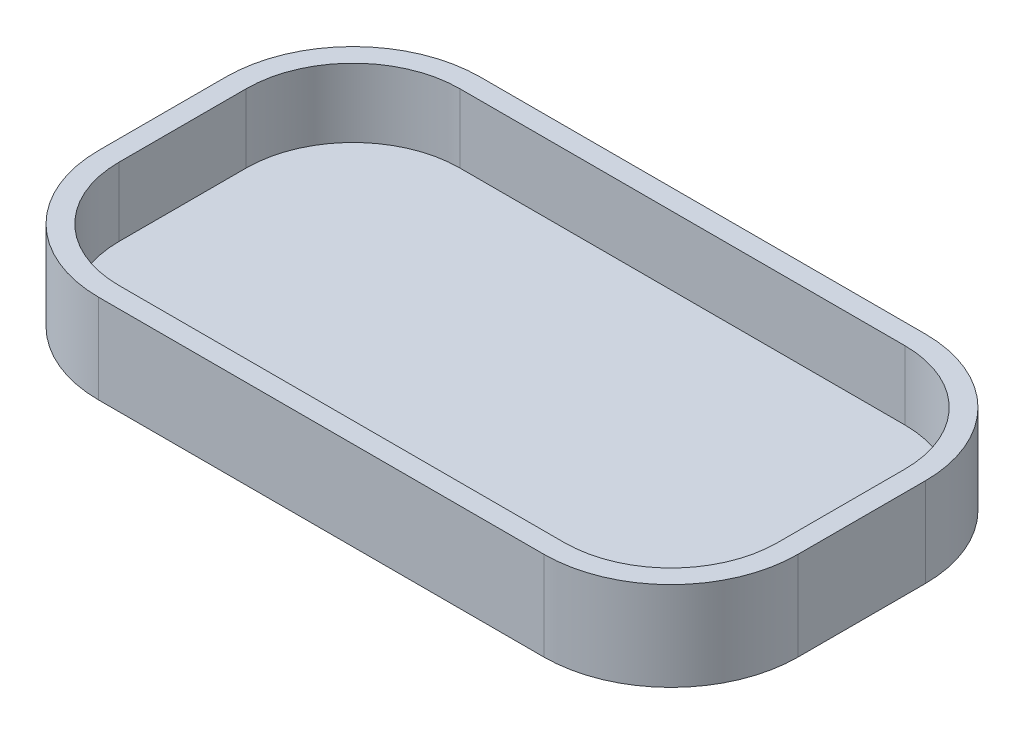
ISO-10303-21;
HEADER;
FILE_DESCRIPTION(('STEP AP214'),'2;1');
FILE_NAME('part.step','',(''),(''),'','','');
FILE_SCHEMA(('AUTOMOTIVE_DESIGN { 1 0 10303 214 1 1 1 1 }'));
ENDSEC;
DATA;
#1=APPLICATION_CONTEXT('core data for automotive mechanical design processes');
#2=APPLICATION_PROTOCOL_DEFINITION('international standard','automotive_design',2000,#1);
#3=PRODUCT_CONTEXT('',#1,'mechanical');
#4=PRODUCT('Part','Part','',(#3));
#5=PRODUCT_RELATED_PRODUCT_CATEGORY('part','',(#4));
#6=PRODUCT_DEFINITION_FORMATION('','',#4);
#7=PRODUCT_DEFINITION_CONTEXT('part definition',#1,'design');
#8=PRODUCT_DEFINITION('design','',#6,#7);
#9=PRODUCT_DEFINITION_SHAPE('','',#8);
#10=(LENGTH_UNIT() NAMED_UNIT(*) SI_UNIT(.MILLI.,.METRE.));
#11=(NAMED_UNIT(*) PLANE_ANGLE_UNIT() SI_UNIT($,.RADIAN.));
#12=(NAMED_UNIT(*) SI_UNIT($,.STERADIAN.) SOLID_ANGLE_UNIT());
#13=UNCERTAINTY_MEASURE_WITH_UNIT(LENGTH_MEASURE(1.E-05),#10,'distance_accuracy_value','');
#14=(GEOMETRIC_REPRESENTATION_CONTEXT(3) GLOBAL_UNCERTAINTY_ASSIGNED_CONTEXT((#13)) GLOBAL_UNIT_ASSIGNED_CONTEXT((#10,
#11,#12)) REPRESENTATION_CONTEXT('',''));
#15=CARTESIAN_POINT('',(0.,0.,0.));
#16=DIRECTION('',(0.,0.,1.));
#17=DIRECTION('',(1.,0.,0.));
#18=AXIS2_PLACEMENT_3D('',#15,#16,#17);
#19=CARTESIAN_POINT('',(0.,7.,0.));
#20=DIRECTION('',(-1.,0.,0.));
#21=DIRECTION('',(0.,0.,1.));
#22=AXIS2_PLACEMENT_3D('',#19,#20,#21);
#23=PLANE('',#22);
#24=DIRECTION('',(0.,0.,-1.));
#25=VECTOR('',#24,1.);
#26=CARTESIAN_POINT('',(0.,0.,0.));
#27=LINE('',#26,#25);
#28=CARTESIAN_POINT('',(0.,0.,-10.));
#29=VERTEX_POINT('',#28);
#30=CARTESIAN_POINT('',(0.,0.,-20.));
#31=VERTEX_POINT('',#30);
#32=EDGE_CURVE('E235',#29,#31,#27,.T.);
#33=ORIENTED_EDGE('',*,*,#32,.T.);
#34=DIRECTION('',(0.,-1.,0.));
#35=VECTOR('',#34,1.);
#36=CARTESIAN_POINT('',(0.,7.,-20.));
#37=LINE('',#36,#35);
#38=CARTESIAN_POINT('',(0.,7.,-20.));
#39=VERTEX_POINT('',#38);
#40=EDGE_CURVE('E312',#31,#39,#37,.F.);
#41=ORIENTED_EDGE('',*,*,#40,.T.);
#42=DIRECTION('',(0.,0.,-1.));
#43=VECTOR('',#42,1.);
#44=CARTESIAN_POINT('',(0.,7.,0.));
#45=LINE('',#44,#43);
#46=CARTESIAN_POINT('',(0.,7.,-10.));
#47=VERTEX_POINT('',#46);
#48=EDGE_CURVE('E263',#47,#39,#45,.T.);
#49=ORIENTED_EDGE('',*,*,#48,.F.);
#50=DIRECTION('',(0.,-1.,0.));
#51=VECTOR('',#50,1.);
#52=CARTESIAN_POINT('',(0.,7.,-10.));
#53=LINE('',#52,#51);
#54=EDGE_CURVE('E313',#47,#29,#53,.T.);
#55=ORIENTED_EDGE('',*,*,#54,.T.);
#56=EDGE_LOOP('',(#33,#41,#49,#55));
#57=FACE_BOUND('',#56,.T.);
#58=ADVANCED_FACE('F51',(#57),#23,.F.);
#59=CARTESIAN_POINT('',(0.,7.,-30.));
#60=DIRECTION('',(0.,0.,1.));
#61=DIRECTION('',(1.,0.,0.));
#62=AXIS2_PLACEMENT_3D('',#59,#60,#61);
#63=PLANE('',#62);
#64=DIRECTION('',(-1.,0.,0.));
#65=VECTOR('',#64,1.);
#66=CARTESIAN_POINT('',(0.,7.,-30.));
#67=LINE('',#66,#65);
#68=CARTESIAN_POINT('',(-10.,7.,-30.));
#69=VERTEX_POINT('',#68);
#70=CARTESIAN_POINT('',(-45.,7.,-30.));
#71=VERTEX_POINT('',#70);
#72=EDGE_CURVE('E270',#69,#71,#67,.T.);
#73=ORIENTED_EDGE('',*,*,#72,.F.);
#74=DIRECTION('',(0.,-1.,0.));
#75=VECTOR('',#74,1.);
#76=CARTESIAN_POINT('',(-10.,7.,-30.));
#77=LINE('',#76,#75);
#78=CARTESIAN_POINT('',(-10.,0.,-30.));
#79=VERTEX_POINT('',#78);
#80=EDGE_CURVE('E293',#69,#79,#77,.T.);
#81=ORIENTED_EDGE('',*,*,#80,.T.);
#82=DIRECTION('',(-1.,0.,0.));
#83=VECTOR('',#82,1.);
#84=CARTESIAN_POINT('',(0.,0.,-30.));
#85=LINE('',#84,#83);
#86=CARTESIAN_POINT('',(-45.,0.,-30.));
#87=VERTEX_POINT('',#86);
#88=EDGE_CURVE('E285',#79,#87,#85,.T.);
#89=ORIENTED_EDGE('',*,*,#88,.T.);
#90=DIRECTION('',(0.,-1.,0.));
#91=VECTOR('',#90,1.);
#92=CARTESIAN_POINT('',(-45.,7.,-30.));
#93=LINE('',#92,#91);
#94=EDGE_CURVE('E276',#87,#71,#93,.F.);
#95=ORIENTED_EDGE('',*,*,#94,.T.);
#96=EDGE_LOOP('',(#73,#81,#89,#95));
#97=FACE_BOUND('',#96,.T.);
#98=ADVANCED_FACE('F370',(#97),#63,.F.);
#99=CARTESIAN_POINT('',(-55.,7.,0.));
#100=DIRECTION('',(1.,0.,0.));
#101=DIRECTION('',(0.,0.,-1.));
#102=AXIS2_PLACEMENT_3D('',#99,#100,#101);
#103=PLANE('',#102);
#104=DIRECTION('',(0.,0.,1.));
#105=VECTOR('',#104,1.);
#106=CARTESIAN_POINT('',(-55.,7.,0.));
#107=LINE('',#106,#105);
#108=CARTESIAN_POINT('',(-55.,7.,-20.));
#109=VERTEX_POINT('',#108);
#110=CARTESIAN_POINT('',(-55.,7.,-10.));
#111=VERTEX_POINT('',#110);
#112=EDGE_CURVE('E275',#109,#111,#107,.T.);
#113=ORIENTED_EDGE('',*,*,#112,.F.);
#114=DIRECTION('',(0.,-1.,0.));
#115=VECTOR('',#114,1.);
#116=CARTESIAN_POINT('',(-55.,7.,-20.));
#117=LINE('',#116,#115);
#118=CARTESIAN_POINT('',(-55.,0.,-20.));
#119=VERTEX_POINT('',#118);
#120=EDGE_CURVE('E11',#109,#119,#117,.T.);
#121=ORIENTED_EDGE('',*,*,#120,.T.);
#122=DIRECTION('',(0.,0.,1.));
#123=VECTOR('',#122,1.);
#124=CARTESIAN_POINT('',(-55.,0.,0.));
#125=LINE('',#124,#123);
#126=CARTESIAN_POINT('',(-55.,0.,-10.));
#127=VERTEX_POINT('',#126);
#128=EDGE_CURVE('E290',#119,#127,#125,.T.);
#129=ORIENTED_EDGE('',*,*,#128,.T.);
#130=DIRECTION('',(0.,-1.,0.));
#131=VECTOR('',#130,1.);
#132=CARTESIAN_POINT('',(-55.,7.,-10.));
#133=LINE('',#132,#131);
#134=EDGE_CURVE('E58',#127,#111,#133,.F.);
#135=ORIENTED_EDGE('',*,*,#134,.T.);
#136=EDGE_LOOP('',(#113,#121,#129,#135));
#137=FACE_BOUND('',#136,.T.);
#138=ADVANCED_FACE('F338',(#137),#103,.F.);
#139=CARTESIAN_POINT('',(0.,7.,0.));
#140=DIRECTION('',(0.,0.,-1.));
#141=DIRECTION('',(-1.,0.,0.));
#142=AXIS2_PLACEMENT_3D('',#139,#140,#141);
#143=PLANE('',#142);
#144=DIRECTION('',(1.,0.,0.));
#145=VECTOR('',#144,1.);
#146=CARTESIAN_POINT('',(0.,0.,0.));
#147=LINE('',#146,#145);
#148=CARTESIAN_POINT('',(-45.,0.,0.));
#149=VERTEX_POINT('',#148);
#150=CARTESIAN_POINT('',(-10.,0.,0.));
#151=VERTEX_POINT('',#150);
#152=EDGE_CURVE('E268',#149,#151,#147,.T.);
#153=ORIENTED_EDGE('',*,*,#152,.T.);
#154=DIRECTION('',(0.,-1.,0.));
#155=VECTOR('',#154,1.);
#156=CARTESIAN_POINT('',(-10.,7.,0.));
#157=LINE('',#156,#155);
#158=CARTESIAN_POINT('',(-10.,7.,0.));
#159=VERTEX_POINT('',#158);
#160=EDGE_CURVE('E73',#151,#159,#157,.F.);
#161=ORIENTED_EDGE('',*,*,#160,.T.);
#162=DIRECTION('',(1.,0.,0.));
#163=VECTOR('',#162,1.);
#164=CARTESIAN_POINT('',(0.,7.,0.));
#165=LINE('',#164,#163);
#166=CARTESIAN_POINT('',(-45.,7.,0.));
#167=VERTEX_POINT('',#166);
#168=EDGE_CURVE('E277',#167,#159,#165,.T.);
#169=ORIENTED_EDGE('',*,*,#168,.F.);
#170=DIRECTION('',(0.,-1.,0.));
#171=VECTOR('',#170,1.);
#172=CARTESIAN_POINT('',(-45.,7.,0.));
#173=LINE('',#172,#171);
#174=EDGE_CURVE('E329',#167,#149,#173,.T.);
#175=ORIENTED_EDGE('',*,*,#174,.T.);
#176=EDGE_LOOP('',(#153,#161,#169,#175));
#177=FACE_BOUND('',#176,.T.);
#178=ADVANCED_FACE('F349',(#177),#143,.F.);
#179=CARTESIAN_POINT('',(0.,7.,0.));
#180=DIRECTION('',(0.,1.,0.));
#181=DIRECTION('',(0.,0.,1.));
#182=AXIS2_PLACEMENT_3D('',#179,#180,#181);
#183=PLANE('',#182);
#184=DIRECTION('',(0.,0.,-1.));
#185=VECTOR('',#184,1.);
#186=CARTESIAN_POINT('',(-1.6,7.,0.));
#187=LINE('',#186,#185);
#188=CARTESIAN_POINT('',(-1.6,7.,-10.));
#189=VERTEX_POINT('',#188);
#190=CARTESIAN_POINT('',(-1.6,7.,-20.));
#191=VERTEX_POINT('',#190);
#192=EDGE_CURVE('E191',#189,#191,#187,.T.);
#193=ORIENTED_EDGE('',*,*,#192,.F.);
#194=CARTESIAN_POINT('',(-10.,7.,-10.));
#195=DIRECTION('',(0.,1.,0.));
#196=DIRECTION('',(0.,0.,1.));
#197=AXIS2_PLACEMENT_3D('',#194,#195,#196);
#198=CIRCLE('',#197,8.4);
#199=CARTESIAN_POINT('',(-10.,7.,-1.6));
#200=VERTEX_POINT('',#199);
#201=EDGE_CURVE('E249',#200,#189,#198,.T.);
#202=ORIENTED_EDGE('',*,*,#201,.F.);
#203=DIRECTION('',(1.,0.,0.));
#204=VECTOR('',#203,1.);
#205=CARTESIAN_POINT('',(0.,7.,-1.6));
#206=LINE('',#205,#204);
#207=CARTESIAN_POINT('',(-45.,7.,-1.6));
#208=VERTEX_POINT('',#207);
#209=EDGE_CURVE('E70',#208,#200,#206,.T.);
#210=ORIENTED_EDGE('',*,*,#209,.F.);
#211=CARTESIAN_POINT('',(-45.,7.,-10.));
#212=DIRECTION('',(0.,1.,0.));
#213=DIRECTION('',(0.,0.,1.));
#214=AXIS2_PLACEMENT_3D('',#211,#212,#213);
#215=CIRCLE('',#214,8.4);
#216=CARTESIAN_POINT('',(-53.4,7.,-10.));
#217=VERTEX_POINT('',#216);
#218=EDGE_CURVE('E196',#217,#208,#215,.T.);
#219=ORIENTED_EDGE('',*,*,#218,.F.);
#220=DIRECTION('',(0.,0.,1.));
#221=VECTOR('',#220,1.);
#222=CARTESIAN_POINT('',(-53.4,7.,0.));
#223=LINE('',#222,#221);
#224=CARTESIAN_POINT('',(-53.4,7.,-20.));
#225=VERTEX_POINT('',#224);
#226=EDGE_CURVE('E251',#225,#217,#223,.T.);
#227=ORIENTED_EDGE('',*,*,#226,.F.);
#228=CARTESIAN_POINT('',(-45.,7.,-20.));
#229=DIRECTION('',(0.,1.,0.));
#230=DIRECTION('',(0.,0.,1.));
#231=AXIS2_PLACEMENT_3D('',#228,#229,#230);
#232=CIRCLE('',#231,8.4);
#233=CARTESIAN_POINT('',(-45.,7.,-28.4));
#234=VERTEX_POINT('',#233);
#235=EDGE_CURVE('E205',#234,#225,#232,.T.);
#236=ORIENTED_EDGE('',*,*,#235,.F.);
#237=DIRECTION('',(-1.,0.,0.));
#238=VECTOR('',#237,1.);
#239=CARTESIAN_POINT('',(0.,7.,-28.4));
#240=LINE('',#239,#238);
#241=CARTESIAN_POINT('',(-10.,7.,-28.4));
#242=VERTEX_POINT('',#241);
#243=EDGE_CURVE('E247',#242,#234,#240,.T.);
#244=ORIENTED_EDGE('',*,*,#243,.F.);
#245=CARTESIAN_POINT('',(-10.,7.,-20.));
#246=DIRECTION('',(0.,1.,0.));
#247=DIRECTION('',(0.,0.,1.));
#248=AXIS2_PLACEMENT_3D('',#245,#246,#247);
#249=CIRCLE('',#248,8.4);
#250=EDGE_CURVE('E244',#191,#242,#249,.T.);
#251=ORIENTED_EDGE('',*,*,#250,.F.);
#252=EDGE_LOOP('',(#193,#202,#210,#219,#227,#236,#244,#251));
#253=FACE_BOUND('',#252,.T.);
#254=ORIENTED_EDGE('',*,*,#48,.T.);
#255=CARTESIAN_POINT('',(-10.,7.,-20.));
#256=DIRECTION('',(0.,1.,0.));
#257=DIRECTION('',(0.,0.,1.));
#258=AXIS2_PLACEMENT_3D('',#255,#256,#257);
#259=CIRCLE('',#258,10.);
#260=EDGE_CURVE('E330',#39,#69,#259,.T.);
#261=ORIENTED_EDGE('',*,*,#260,.T.);
#262=ORIENTED_EDGE('',*,*,#72,.T.);
#263=CARTESIAN_POINT('',(-45.,7.,-20.));
#264=DIRECTION('',(0.,1.,0.));
#265=DIRECTION('',(0.,0.,1.));
#266=AXIS2_PLACEMENT_3D('',#263,#264,#265);
#267=CIRCLE('',#266,10.);
#268=EDGE_CURVE('E321',#71,#109,#267,.T.);
#269=ORIENTED_EDGE('',*,*,#268,.T.);
#270=ORIENTED_EDGE('',*,*,#112,.T.);
#271=CARTESIAN_POINT('',(-45.,7.,-10.));
#272=DIRECTION('',(0.,1.,0.));
#273=DIRECTION('',(0.,0.,1.));
#274=AXIS2_PLACEMENT_3D('',#271,#272,#273);
#275=CIRCLE('',#274,10.);
#276=EDGE_CURVE('E318',#111,#167,#275,.T.);
#277=ORIENTED_EDGE('',*,*,#276,.T.);
#278=ORIENTED_EDGE('',*,*,#168,.T.);
#279=CARTESIAN_POINT('',(-10.,7.,-10.));
#280=DIRECTION('',(0.,1.,0.));
#281=DIRECTION('',(0.,0.,1.));
#282=AXIS2_PLACEMENT_3D('',#279,#280,#281);
#283=CIRCLE('',#282,10.);
#284=EDGE_CURVE('E322',#159,#47,#283,.T.);
#285=ORIENTED_EDGE('',*,*,#284,.T.);
#286=EDGE_LOOP('',(#254,#261,#262,#269,#270,#277,#278,#285));
#287=FACE_BOUND('',#286,.T.);
#288=ADVANCED_FACE('F341',(#253,#287),#183,.T.);
#289=CARTESIAN_POINT('',(0.,0.,0.));
#290=DIRECTION('',(0.,1.,0.));
#291=DIRECTION('',(0.,0.,1.));
#292=AXIS2_PLACEMENT_3D('',#289,#290,#291);
#293=PLANE('',#292);
#294=ORIENTED_EDGE('',*,*,#88,.F.);
#295=CARTESIAN_POINT('',(-10.,0.,-20.));
#296=DIRECTION('',(0.,1.,0.));
#297=DIRECTION('',(0.,0.,1.));
#298=AXIS2_PLACEMENT_3D('',#295,#296,#297);
#299=CIRCLE('',#298,10.);
#300=EDGE_CURVE('E306',#79,#31,#299,.F.);
#301=ORIENTED_EDGE('',*,*,#300,.T.);
#302=ORIENTED_EDGE('',*,*,#32,.F.);
#303=CARTESIAN_POINT('',(-10.,0.,-10.));
#304=DIRECTION('',(0.,1.,0.));
#305=DIRECTION('',(0.,0.,1.));
#306=AXIS2_PLACEMENT_3D('',#303,#304,#305);
#307=CIRCLE('',#306,10.);
#308=EDGE_CURVE('E301',#29,#151,#307,.F.);
#309=ORIENTED_EDGE('',*,*,#308,.T.);
#310=ORIENTED_EDGE('',*,*,#152,.F.);
#311=CARTESIAN_POINT('',(-45.,0.,-10.));
#312=DIRECTION('',(0.,1.,0.));
#313=DIRECTION('',(0.,0.,1.));
#314=AXIS2_PLACEMENT_3D('',#311,#312,#313);
#315=CIRCLE('',#314,10.);
#316=EDGE_CURVE('E298',#149,#127,#315,.F.);
#317=ORIENTED_EDGE('',*,*,#316,.T.);
#318=ORIENTED_EDGE('',*,*,#128,.F.);
#319=CARTESIAN_POINT('',(-45.,0.,-20.));
#320=DIRECTION('',(0.,1.,0.));
#321=DIRECTION('',(0.,0.,1.));
#322=AXIS2_PLACEMENT_3D('',#319,#320,#321);
#323=CIRCLE('',#322,10.);
#324=EDGE_CURVE('E305',#119,#87,#323,.F.);
#325=ORIENTED_EDGE('',*,*,#324,.T.);
#326=EDGE_LOOP('',(#294,#301,#302,#309,#310,#317,#318,#325));
#327=FACE_BOUND('',#326,.T.);
#328=ADVANCED_FACE('F351',(#327),#293,.F.);
#329=CARTESIAN_POINT('',(-10.,7.,-20.));
#330=DIRECTION('',(0.,-1.,0.));
#331=DIRECTION('',(0.,0.,-1.));
#332=AXIS2_PLACEMENT_3D('',#329,#330,#331);
#333=CYLINDRICAL_SURFACE('',#332,10.);
#334=ORIENTED_EDGE('',*,*,#260,.F.);
#335=ORIENTED_EDGE('',*,*,#40,.F.);
#336=ORIENTED_EDGE('',*,*,#300,.F.);
#337=ORIENTED_EDGE('',*,*,#80,.F.);
#338=EDGE_LOOP('',(#334,#335,#336,#337));
#339=FACE_BOUND('',#338,.T.);
#340=ADVANCED_FACE('F364',(#339),#333,.T.);
#341=CARTESIAN_POINT('',(-10.,7.,-10.));
#342=DIRECTION('',(0.,-1.,0.));
#343=DIRECTION('',(0.,0.,-1.));
#344=AXIS2_PLACEMENT_3D('',#341,#342,#343);
#345=CYLINDRICAL_SURFACE('',#344,10.);
#346=ORIENTED_EDGE('',*,*,#284,.F.);
#347=ORIENTED_EDGE('',*,*,#160,.F.);
#348=ORIENTED_EDGE('',*,*,#308,.F.);
#349=ORIENTED_EDGE('',*,*,#54,.F.);
#350=EDGE_LOOP('',(#346,#347,#348,#349));
#351=FACE_BOUND('',#350,.T.);
#352=ADVANCED_FACE('F360',(#351),#345,.T.);
#353=CARTESIAN_POINT('',(-45.,7.,-20.));
#354=DIRECTION('',(0.,-1.,0.));
#355=DIRECTION('',(0.,0.,-1.));
#356=AXIS2_PLACEMENT_3D('',#353,#354,#355);
#357=CYLINDRICAL_SURFACE('',#356,10.);
#358=ORIENTED_EDGE('',*,*,#268,.F.);
#359=ORIENTED_EDGE('',*,*,#94,.F.);
#360=ORIENTED_EDGE('',*,*,#324,.F.);
#361=ORIENTED_EDGE('',*,*,#120,.F.);
#362=EDGE_LOOP('',(#358,#359,#360,#361));
#363=FACE_BOUND('',#362,.T.);
#364=ADVANCED_FACE('F367',(#363),#357,.T.);
#365=CARTESIAN_POINT('',(-45.,7.,-10.));
#366=DIRECTION('',(0.,-1.,0.));
#367=DIRECTION('',(0.,0.,-1.));
#368=AXIS2_PLACEMENT_3D('',#365,#366,#367);
#369=CYLINDRICAL_SURFACE('',#368,10.);
#370=ORIENTED_EDGE('',*,*,#276,.F.);
#371=ORIENTED_EDGE('',*,*,#134,.F.);
#372=ORIENTED_EDGE('',*,*,#316,.F.);
#373=ORIENTED_EDGE('',*,*,#174,.F.);
#374=EDGE_LOOP('',(#370,#371,#372,#373));
#375=FACE_BOUND('',#374,.T.);
#376=ADVANCED_FACE('F52',(#375),#369,.T.);
#377=CARTESIAN_POINT('',(-1.6,7.,0.));
#378=DIRECTION('',(-1.,0.,0.));
#379=DIRECTION('',(0.,0.,1.));
#380=AXIS2_PLACEMENT_3D('',#377,#378,#379);
#381=PLANE('',#380);
#382=DIRECTION('',(0.,0.,-1.));
#383=VECTOR('',#382,1.);
#384=CARTESIAN_POINT('',(-1.6,1.6,0.));
#385=LINE('',#384,#383);
#386=CARTESIAN_POINT('',(-1.6,1.6,-10.));
#387=VERTEX_POINT('',#386);
#388=CARTESIAN_POINT('',(-1.6,1.6,-20.));
#389=VERTEX_POINT('',#388);
#390=EDGE_CURVE('E184',#387,#389,#385,.T.);
#391=ORIENTED_EDGE('',*,*,#390,.F.);
#392=DIRECTION('',(0.,1.,0.));
#393=VECTOR('',#392,1.);
#394=CARTESIAN_POINT('',(-1.6,7.,-10.));
#395=LINE('',#394,#393);
#396=EDGE_CURVE('E176',#189,#387,#395,.F.);
#397=ORIENTED_EDGE('',*,*,#396,.F.);
#398=ORIENTED_EDGE('',*,*,#192,.T.);
#399=DIRECTION('',(0.,1.,0.));
#400=VECTOR('',#399,1.);
#401=CARTESIAN_POINT('',(-1.6,7.,-20.));
#402=LINE('',#401,#400);
#403=EDGE_CURVE('E171',#389,#191,#402,.T.);
#404=ORIENTED_EDGE('',*,*,#403,.F.);
#405=EDGE_LOOP('',(#391,#397,#398,#404));
#406=FACE_BOUND('',#405,.T.);
#407=ADVANCED_FACE('F193',(#406),#381,.T.);
#408=CARTESIAN_POINT('',(0.,7.,-28.4));
#409=DIRECTION('',(0.,0.,1.));
#410=DIRECTION('',(1.,0.,0.));
#411=AXIS2_PLACEMENT_3D('',#408,#409,#410);
#412=PLANE('',#411);
#413=ORIENTED_EDGE('',*,*,#243,.T.);
#414=DIRECTION('',(0.,1.,0.));
#415=VECTOR('',#414,1.);
#416=CARTESIAN_POINT('',(-45.,7.,-28.4));
#417=LINE('',#416,#415);
#418=CARTESIAN_POINT('',(-45.,1.6,-28.4));
#419=VERTEX_POINT('',#418);
#420=EDGE_CURVE('E223',#419,#234,#417,.T.);
#421=ORIENTED_EDGE('',*,*,#420,.F.);
#422=DIRECTION('',(-1.,0.,0.));
#423=VECTOR('',#422,1.);
#424=CARTESIAN_POINT('',(0.,1.6,-28.4));
#425=LINE('',#424,#423);
#426=CARTESIAN_POINT('',(-10.,1.6,-28.4));
#427=VERTEX_POINT('',#426);
#428=EDGE_CURVE('E192',#427,#419,#425,.T.);
#429=ORIENTED_EDGE('',*,*,#428,.F.);
#430=DIRECTION('',(0.,1.,0.));
#431=VECTOR('',#430,1.);
#432=CARTESIAN_POINT('',(-10.,7.,-28.4));
#433=LINE('',#432,#431);
#434=EDGE_CURVE('E172',#242,#427,#433,.F.);
#435=ORIENTED_EDGE('',*,*,#434,.F.);
#436=EDGE_LOOP('',(#413,#421,#429,#435));
#437=FACE_BOUND('',#436,.T.);
#438=ADVANCED_FACE('F449',(#437),#412,.T.);
#439=CARTESIAN_POINT('',(-53.4,7.,0.));
#440=DIRECTION('',(1.,0.,0.));
#441=DIRECTION('',(0.,0.,-1.));
#442=AXIS2_PLACEMENT_3D('',#439,#440,#441);
#443=PLANE('',#442);
#444=ORIENTED_EDGE('',*,*,#226,.T.);
#445=DIRECTION('',(0.,1.,0.));
#446=VECTOR('',#445,1.);
#447=CARTESIAN_POINT('',(-53.4,7.,-10.));
#448=LINE('',#447,#446);
#449=CARTESIAN_POINT('',(-53.4,1.6,-10.));
#450=VERTEX_POINT('',#449);
#451=EDGE_CURVE('E233',#450,#217,#448,.T.);
#452=ORIENTED_EDGE('',*,*,#451,.F.);
#453=DIRECTION('',(0.,0.,1.));
#454=VECTOR('',#453,1.);
#455=CARTESIAN_POINT('',(-53.4,1.6,0.));
#456=LINE('',#455,#454);
#457=CARTESIAN_POINT('',(-53.4,1.6,-20.));
#458=VERTEX_POINT('',#457);
#459=EDGE_CURVE('E210',#458,#450,#456,.T.);
#460=ORIENTED_EDGE('',*,*,#459,.F.);
#461=DIRECTION('',(0.,1.,0.));
#462=VECTOR('',#461,1.);
#463=CARTESIAN_POINT('',(-53.4,7.,-20.));
#464=LINE('',#463,#462);
#465=EDGE_CURVE('E230',#225,#458,#464,.F.);
#466=ORIENTED_EDGE('',*,*,#465,.F.);
#467=EDGE_LOOP('',(#444,#452,#460,#466));
#468=FACE_BOUND('',#467,.T.);
#469=ADVANCED_FACE('F451',(#468),#443,.T.);
#470=CARTESIAN_POINT('',(0.,7.,-1.6));
#471=DIRECTION('',(0.,0.,-1.));
#472=DIRECTION('',(-1.,0.,0.));
#473=AXIS2_PLACEMENT_3D('',#470,#471,#472);
#474=PLANE('',#473);
#475=DIRECTION('',(1.,0.,0.));
#476=VECTOR('',#475,1.);
#477=CARTESIAN_POINT('',(0.,1.6,-1.6));
#478=LINE('',#477,#476);
#479=CARTESIAN_POINT('',(-45.,1.6,-1.6));
#480=VERTEX_POINT('',#479);
#481=CARTESIAN_POINT('',(-10.,1.6,-1.6));
#482=VERTEX_POINT('',#481);
#483=EDGE_CURVE('E215',#480,#482,#478,.T.);
#484=ORIENTED_EDGE('',*,*,#483,.F.);
#485=DIRECTION('',(0.,1.,0.));
#486=VECTOR('',#485,1.);
#487=CARTESIAN_POINT('',(-45.,7.,-1.6));
#488=LINE('',#487,#486);
#489=EDGE_CURVE('E240',#208,#480,#488,.F.);
#490=ORIENTED_EDGE('',*,*,#489,.F.);
#491=ORIENTED_EDGE('',*,*,#209,.T.);
#492=DIRECTION('',(0.,1.,0.));
#493=VECTOR('',#492,1.);
#494=CARTESIAN_POINT('',(-10.,7.,-1.6));
#495=LINE('',#494,#493);
#496=EDGE_CURVE('E237',#482,#200,#495,.T.);
#497=ORIENTED_EDGE('',*,*,#496,.F.);
#498=EDGE_LOOP('',(#484,#490,#491,#497));
#499=FACE_BOUND('',#498,.T.);
#500=ADVANCED_FACE('F463',(#499),#474,.T.);
#501=CARTESIAN_POINT('',(0.,1.6,0.));
#502=DIRECTION('',(0.,1.,0.));
#503=DIRECTION('',(0.,0.,1.));
#504=AXIS2_PLACEMENT_3D('',#501,#502,#503);
#505=PLANE('',#504);
#506=ORIENTED_EDGE('',*,*,#428,.T.);
#507=CARTESIAN_POINT('',(-45.,1.6,-20.));
#508=DIRECTION('',(0.,1.,0.));
#509=DIRECTION('',(0.,0.,1.));
#510=AXIS2_PLACEMENT_3D('',#507,#508,#509);
#511=CIRCLE('',#510,8.4);
#512=EDGE_CURVE('E211',#458,#419,#511,.F.);
#513=ORIENTED_EDGE('',*,*,#512,.F.);
#514=ORIENTED_EDGE('',*,*,#459,.T.);
#515=CARTESIAN_POINT('',(-45.,1.6,-10.));
#516=DIRECTION('',(0.,1.,0.));
#517=DIRECTION('',(0.,0.,1.));
#518=AXIS2_PLACEMENT_3D('',#515,#516,#517);
#519=CIRCLE('',#518,8.4);
#520=EDGE_CURVE('E214',#480,#450,#519,.F.);
#521=ORIENTED_EDGE('',*,*,#520,.F.);
#522=ORIENTED_EDGE('',*,*,#483,.T.);
#523=CARTESIAN_POINT('',(-10.,1.6,-10.));
#524=DIRECTION('',(0.,1.,0.));
#525=DIRECTION('',(0.,0.,1.));
#526=AXIS2_PLACEMENT_3D('',#523,#524,#525);
#527=CIRCLE('',#526,8.4);
#528=EDGE_CURVE('E182',#387,#482,#527,.F.);
#529=ORIENTED_EDGE('',*,*,#528,.F.);
#530=ORIENTED_EDGE('',*,*,#390,.T.);
#531=CARTESIAN_POINT('',(-10.,1.6,-20.));
#532=DIRECTION('',(0.,1.,0.));
#533=DIRECTION('',(0.,0.,1.));
#534=AXIS2_PLACEMENT_3D('',#531,#532,#533);
#535=CIRCLE('',#534,8.4);
#536=EDGE_CURVE('E169',#427,#389,#535,.F.);
#537=ORIENTED_EDGE('',*,*,#536,.F.);
#538=EDGE_LOOP('',(#506,#513,#514,#521,#522,#529,#530,#537));
#539=FACE_BOUND('',#538,.T.);
#540=ADVANCED_FACE('F183',(#539),#505,.T.);
#541=CARTESIAN_POINT('',(-10.,7.,-20.));
#542=DIRECTION('',(0.,-1.,0.));
#543=DIRECTION('',(0.,0.,-1.));
#544=AXIS2_PLACEMENT_3D('',#541,#542,#543);
#545=CYLINDRICAL_SURFACE('',#544,8.4);
#546=ORIENTED_EDGE('',*,*,#250,.T.);
#547=ORIENTED_EDGE('',*,*,#434,.T.);
#548=ORIENTED_EDGE('',*,*,#536,.T.);
#549=ORIENTED_EDGE('',*,*,#403,.T.);
#550=EDGE_LOOP('',(#546,#547,#548,#549));
#551=FACE_BOUND('',#550,.T.);
#552=ADVANCED_FACE('F168',(#551),#545,.F.);
#553=CARTESIAN_POINT('',(-10.,7.,-10.));
#554=DIRECTION('',(0.,-1.,0.));
#555=DIRECTION('',(0.,0.,-1.));
#556=AXIS2_PLACEMENT_3D('',#553,#554,#555);
#557=CYLINDRICAL_SURFACE('',#556,8.4);
#558=ORIENTED_EDGE('',*,*,#201,.T.);
#559=ORIENTED_EDGE('',*,*,#396,.T.);
#560=ORIENTED_EDGE('',*,*,#528,.T.);
#561=ORIENTED_EDGE('',*,*,#496,.T.);
#562=EDGE_LOOP('',(#558,#559,#560,#561));
#563=FACE_BOUND('',#562,.T.);
#564=ADVANCED_FACE('F491',(#563),#557,.F.);
#565=CARTESIAN_POINT('',(-45.,7.,-20.));
#566=DIRECTION('',(0.,-1.,0.));
#567=DIRECTION('',(0.,0.,-1.));
#568=AXIS2_PLACEMENT_3D('',#565,#566,#567);
#569=CYLINDRICAL_SURFACE('',#568,8.4);
#570=ORIENTED_EDGE('',*,*,#235,.T.);
#571=ORIENTED_EDGE('',*,*,#465,.T.);
#572=ORIENTED_EDGE('',*,*,#512,.T.);
#573=ORIENTED_EDGE('',*,*,#420,.T.);
#574=EDGE_LOOP('',(#570,#571,#572,#573));
#575=FACE_BOUND('',#574,.T.);
#576=ADVANCED_FACE('F496',(#575),#569,.F.);
#577=CARTESIAN_POINT('',(-45.,7.,-10.));
#578=DIRECTION('',(0.,-1.,0.));
#579=DIRECTION('',(0.,0.,-1.));
#580=AXIS2_PLACEMENT_3D('',#577,#578,#579);
#581=CYLINDRICAL_SURFACE('',#580,8.4);
#582=ORIENTED_EDGE('',*,*,#218,.T.);
#583=ORIENTED_EDGE('',*,*,#489,.T.);
#584=ORIENTED_EDGE('',*,*,#520,.T.);
#585=ORIENTED_EDGE('',*,*,#451,.T.);
#586=EDGE_LOOP('',(#582,#583,#584,#585));
#587=FACE_BOUND('',#586,.T.);
#588=ADVANCED_FACE('F508',(#587),#581,.F.);
#589=CLOSED_SHELL('',(#58,#98,#138,#178,#288,#328,#340,#352,#364,#376,#407,#438,#469,#500,#540,
#552,#564,#576,#588));
#590=MANIFOLD_SOLID_BREP('B2',#589);
#591=ADVANCED_BREP_SHAPE_REPRESENTATION('',(#18,#590),#14);
#592=SHAPE_DEFINITION_REPRESENTATION(#9,#591);
ENDSEC;
END-ISO-10303-21;
